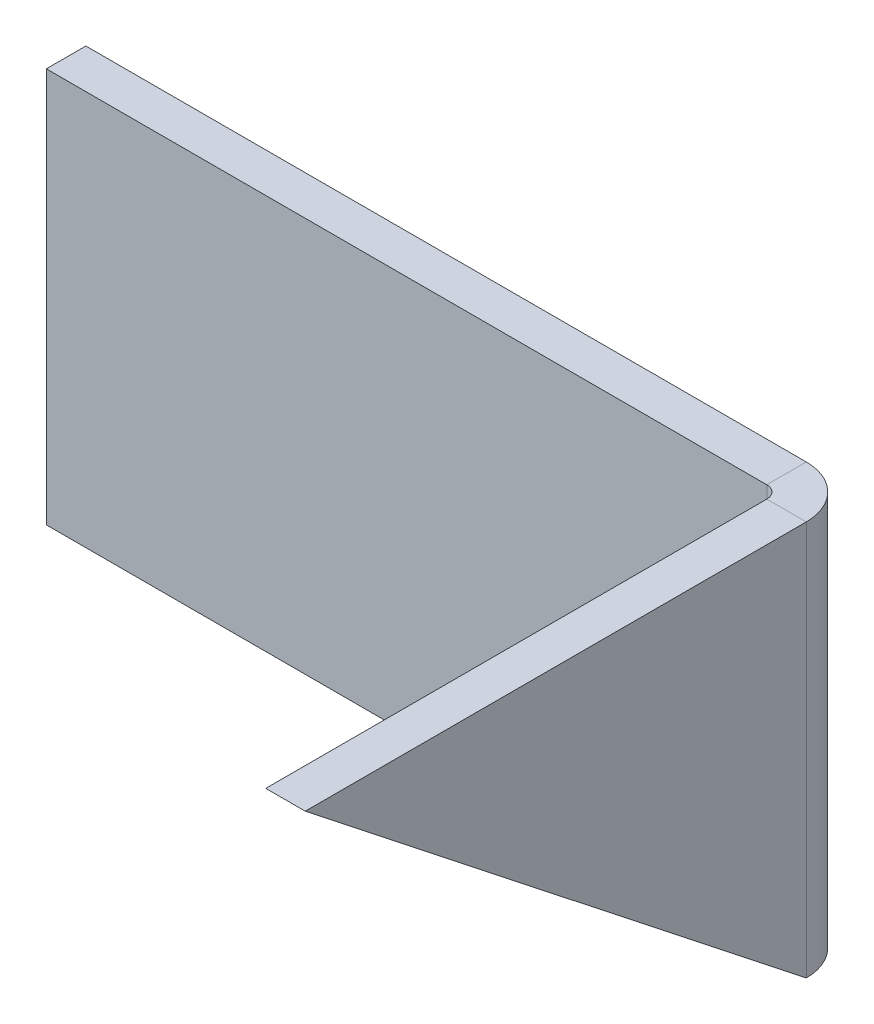
ISO-10303-21;
HEADER;
FILE_DESCRIPTION(('STEP AP214'),'2;1');
FILE_NAME('part.step','',(''),(''),'','','');
FILE_SCHEMA(('AUTOMOTIVE_DESIGN { 1 0 10303 214 1 1 1 1 }'));
ENDSEC;
DATA;
#1=APPLICATION_CONTEXT('core data for automotive mechanical design processes');
#2=APPLICATION_PROTOCOL_DEFINITION('international standard','automotive_design',2000,#1);
#3=PRODUCT_CONTEXT('',#1,'mechanical');
#4=PRODUCT('Part','Part','',(#3));
#5=PRODUCT_RELATED_PRODUCT_CATEGORY('part','',(#4));
#6=PRODUCT_DEFINITION_FORMATION('','',#4);
#7=PRODUCT_DEFINITION_CONTEXT('part definition',#1,'design');
#8=PRODUCT_DEFINITION('design','',#6,#7);
#9=PRODUCT_DEFINITION_SHAPE('','',#8);
#10=(LENGTH_UNIT() NAMED_UNIT(*) SI_UNIT(.MILLI.,.METRE.));
#11=(NAMED_UNIT(*) PLANE_ANGLE_UNIT() SI_UNIT($,.RADIAN.));
#12=(NAMED_UNIT(*) SI_UNIT($,.STERADIAN.) SOLID_ANGLE_UNIT());
#13=UNCERTAINTY_MEASURE_WITH_UNIT(LENGTH_MEASURE(1.E-05),#10,'distance_accuracy_value','');
#14=(GEOMETRIC_REPRESENTATION_CONTEXT(3) GLOBAL_UNCERTAINTY_ASSIGNED_CONTEXT((#13)) GLOBAL_UNIT_ASSIGNED_CONTEXT((#10,
#11,#12)) REPRESENTATION_CONTEXT('',''));
#15=CARTESIAN_POINT('',(0.,0.,0.));
#16=DIRECTION('',(0.,0.,1.));
#17=DIRECTION('',(1.,0.,0.));
#18=AXIS2_PLACEMENT_3D('',#15,#16,#17);
#19=CARTESIAN_POINT('',(33.131,0.,-1.13311373287466E-13));
#20=DIRECTION('',(-1.,0.,0.));
#21=DIRECTION('',(0.,0.,1.));
#22=AXIS2_PLACEMENT_3D('',#19,#20,#21);
#23=PLANE('',#22);
#24=DIRECTION('',(0.,-0.619090944115098,-0.785319299975924));
#25=VECTOR('',#24,1.);
#26=CARTESIAN_POINT('',(33.131,-15.875,4.17499999999999));
#27=LINE('',#26,#25);
#28=CARTESIAN_POINT('',(33.1310000000001,15.875,44.45));
#29=VERTEX_POINT('',#28);
#30=CARTESIAN_POINT('',(33.131,-15.875,4.17499999999999));
#31=VERTEX_POINT('',#30);
#32=EDGE_CURVE('E131',#29,#31,#27,.T.);
#33=ORIENTED_EDGE('',*,*,#32,.T.);
#34=DIRECTION('',(0.,1.,0.));
#35=VECTOR('',#34,1.);
#36=CARTESIAN_POINT('',(33.131,-15.875,4.17499999999999));
#37=LINE('',#36,#35);
#38=CARTESIAN_POINT('',(33.131,15.875,4.17499999999999));
#39=VERTEX_POINT('',#38);
#40=EDGE_CURVE('E151',#39,#31,#37,.F.);
#41=ORIENTED_EDGE('',*,*,#40,.F.);
#42=DIRECTION('',(0.,0.,1.));
#43=VECTOR('',#42,1.);
#44=CARTESIAN_POINT('',(33.131,15.875,-1.09308165265981E-13));
#45=LINE('',#44,#43);
#46=EDGE_CURVE('E137',#39,#29,#45,.T.);
#47=ORIENTED_EDGE('',*,*,#46,.T.);
#48=EDGE_LOOP('',(#33,#41,#47));
#49=FACE_BOUND('',#48,.T.);
#50=ADVANCED_FACE('F58',(#49),#23,.F.);
#51=CARTESIAN_POINT('',(29.956,0.,-1.02225920036639E-13));
#52=DIRECTION('',(-1.,0.,0.));
#53=DIRECTION('',(0.,0.,1.));
#54=AXIS2_PLACEMENT_3D('',#51,#52,#53);
#55=PLANE('',#54);
#56=DIRECTION('',(0.,1.,0.));
#57=VECTOR('',#56,1.);
#58=CARTESIAN_POINT('',(29.956,-15.875,4.175));
#59=LINE('',#58,#57);
#60=CARTESIAN_POINT('',(29.956,-15.875,4.175));
#61=VERTEX_POINT('',#60);
#62=CARTESIAN_POINT('',(29.956,15.875,4.175));
#63=VERTEX_POINT('',#62);
#64=EDGE_CURVE('E144',#61,#63,#59,.T.);
#65=ORIENTED_EDGE('',*,*,#64,.F.);
#66=DIRECTION('',(0.,-0.619090944115098,-0.785319299975924));
#67=VECTOR('',#66,1.);
#68=CARTESIAN_POINT('',(29.956,-15.875,4.175));
#69=LINE('',#68,#67);
#70=CARTESIAN_POINT('',(29.9560000000001,15.875,44.45));
#71=VERTEX_POINT('',#70);
#72=EDGE_CURVE('E128',#71,#61,#69,.T.);
#73=ORIENTED_EDGE('',*,*,#72,.F.);
#74=DIRECTION('',(0.,0.,-1.));
#75=VECTOR('',#74,1.);
#76=CARTESIAN_POINT('',(29.9560000000001,15.875,44.45));
#77=LINE('',#76,#75);
#78=EDGE_CURVE('E143',#63,#71,#77,.F.);
#79=ORIENTED_EDGE('',*,*,#78,.F.);
#80=EDGE_LOOP('',(#65,#73,#79));
#81=FACE_BOUND('',#80,.T.);
#82=ADVANCED_FACE('F142',(#81),#55,.T.);
#83=CARTESIAN_POINT('',(-28.956,15.875,3.175));
#84=DIRECTION('',(0.,-1.,0.));
#85=DIRECTION('',(0.,0.,-1.));
#86=AXIS2_PLACEMENT_3D('',#83,#84,#85);
#87=PLANE('',#86);
#88=DIRECTION('',(-1.,0.,0.));
#89=VECTOR('',#88,1.);
#90=CARTESIAN_POINT('',(-28.956,15.875,0.));
#91=LINE('',#90,#89);
#92=CARTESIAN_POINT('',(28.956,15.875,0.));
#93=VERTEX_POINT('',#92);
#94=CARTESIAN_POINT('',(-28.956,15.875,0.));
#95=VERTEX_POINT('',#94);
#96=EDGE_CURVE('E181',#93,#95,#91,.T.);
#97=ORIENTED_EDGE('',*,*,#96,.T.);
#98=DIRECTION('',(0.,0.,-1.));
#99=VECTOR('',#98,1.);
#100=CARTESIAN_POINT('',(-28.956,15.875,3.175));
#101=LINE('',#100,#99);
#102=CARTESIAN_POINT('',(-28.956,15.875,3.175));
#103=VERTEX_POINT('',#102);
#104=EDGE_CURVE('E67',#103,#95,#101,.T.);
#105=ORIENTED_EDGE('',*,*,#104,.F.);
#106=DIRECTION('',(-1.,0.,0.));
#107=VECTOR('',#106,1.);
#108=CARTESIAN_POINT('',(-28.956,15.875,3.175));
#109=LINE('',#108,#107);
#110=CARTESIAN_POINT('',(28.956,15.875,3.175));
#111=VERTEX_POINT('',#110);
#112=EDGE_CURVE('E103',#111,#103,#109,.T.);
#113=ORIENTED_EDGE('',*,*,#112,.F.);
#114=DIRECTION('',(0.,0.,-1.));
#115=VECTOR('',#114,1.);
#116=CARTESIAN_POINT('',(28.956,15.875,3.175));
#117=LINE('',#116,#115);
#118=EDGE_CURVE('E13',#111,#93,#117,.T.);
#119=ORIENTED_EDGE('',*,*,#118,.T.);
#120=EDGE_LOOP('',(#97,#105,#113,#119));
#121=FACE_BOUND('',#120,.T.);
#122=ADVANCED_FACE('F60',(#121),#87,.F.);
#123=CARTESIAN_POINT('',(-28.956,15.875,3.175));
#124=DIRECTION('',(1.,0.,0.));
#125=DIRECTION('',(0.,1.,0.));
#126=AXIS2_PLACEMENT_3D('',#123,#124,#125);
#127=PLANE('',#126);
#128=DIRECTION('',(0.,-1.,0.));
#129=VECTOR('',#128,1.);
#130=CARTESIAN_POINT('',(-28.956,15.875,0.));
#131=LINE('',#130,#129);
#132=CARTESIAN_POINT('',(-28.956,-15.875,0.));
#133=VERTEX_POINT('',#132);
#134=EDGE_CURVE('E90',#95,#133,#131,.T.);
#135=ORIENTED_EDGE('',*,*,#134,.T.);
#136=DIRECTION('',(0.,0.,-1.));
#137=VECTOR('',#136,1.);
#138=CARTESIAN_POINT('',(-28.956,-15.875,3.175));
#139=LINE('',#138,#137);
#140=CARTESIAN_POINT('',(-28.956,-15.875,3.175));
#141=VERTEX_POINT('',#140);
#142=EDGE_CURVE('E187',#141,#133,#139,.T.);
#143=ORIENTED_EDGE('',*,*,#142,.F.);
#144=DIRECTION('',(0.,-1.,0.));
#145=VECTOR('',#144,1.);
#146=CARTESIAN_POINT('',(-28.956,15.875,3.175));
#147=LINE('',#146,#145);
#148=EDGE_CURVE('E175',#103,#141,#147,.T.);
#149=ORIENTED_EDGE('',*,*,#148,.F.);
#150=ORIENTED_EDGE('',*,*,#104,.T.);
#151=EDGE_LOOP('',(#135,#143,#149,#150));
#152=FACE_BOUND('',#151,.T.);
#153=ADVANCED_FACE('F189',(#152),#127,.F.);
#154=CARTESIAN_POINT('',(-28.956,-15.875,3.175));
#155=DIRECTION('',(0.,1.,0.));
#156=DIRECTION('',(0.,0.,1.));
#157=AXIS2_PLACEMENT_3D('',#154,#155,#156);
#158=PLANE('',#157);
#159=DIRECTION('',(1.,0.,0.));
#160=VECTOR('',#159,1.);
#161=CARTESIAN_POINT('',(-28.956,-15.875,0.));
#162=LINE('',#161,#160);
#163=CARTESIAN_POINT('',(28.956,-15.875,0.));
#164=VERTEX_POINT('',#163);
#165=EDGE_CURVE('E96',#133,#164,#162,.T.);
#166=ORIENTED_EDGE('',*,*,#165,.T.);
#167=DIRECTION('',(0.,0.,-1.));
#168=VECTOR('',#167,1.);
#169=CARTESIAN_POINT('',(28.956,-15.875,3.175));
#170=LINE('',#169,#168);
#171=CARTESIAN_POINT('',(28.956,-15.875,3.175));
#172=VERTEX_POINT('',#171);
#173=EDGE_CURVE('E178',#172,#164,#170,.T.);
#174=ORIENTED_EDGE('',*,*,#173,.F.);
#175=DIRECTION('',(1.,0.,0.));
#176=VECTOR('',#175,1.);
#177=CARTESIAN_POINT('',(-28.956,-15.875,3.175));
#178=LINE('',#177,#176);
#179=EDGE_CURVE('E75',#141,#172,#178,.T.);
#180=ORIENTED_EDGE('',*,*,#179,.F.);
#181=ORIENTED_EDGE('',*,*,#142,.T.);
#182=EDGE_LOOP('',(#166,#174,#180,#181));
#183=FACE_BOUND('',#182,.T.);
#184=ADVANCED_FACE('F228',(#183),#158,.F.);
#185=CARTESIAN_POINT('',(0.,0.,3.175));
#186=DIRECTION('',(0.,0.,1.));
#187=DIRECTION('',(1.,0.,0.));
#188=AXIS2_PLACEMENT_3D('',#185,#186,#187);
#189=PLANE('',#188);
#190=DIRECTION('',(0.,1.,0.));
#191=VECTOR('',#190,1.);
#192=CARTESIAN_POINT('',(28.956,15.875,3.175));
#193=LINE('',#192,#191);
#194=EDGE_CURVE('E172',#172,#111,#193,.T.);
#195=ORIENTED_EDGE('',*,*,#194,.T.);
#196=ORIENTED_EDGE('',*,*,#112,.T.);
#197=ORIENTED_EDGE('',*,*,#148,.T.);
#198=ORIENTED_EDGE('',*,*,#179,.T.);
#199=EDGE_LOOP('',(#195,#196,#197,#198));
#200=FACE_BOUND('',#199,.T.);
#201=ADVANCED_FACE('F225',(#200),#189,.T.);
#202=CARTESIAN_POINT('',(0.,0.,0.));
#203=DIRECTION('',(0.,0.,1.));
#204=DIRECTION('',(1.,0.,0.));
#205=AXIS2_PLACEMENT_3D('',#202,#203,#204);
#206=PLANE('',#205);
#207=DIRECTION('',(0.,1.,0.));
#208=VECTOR('',#207,1.);
#209=CARTESIAN_POINT('',(28.956,15.875,0.));
#210=LINE('',#209,#208);
#211=EDGE_CURVE('E163',#164,#93,#210,.T.);
#212=ORIENTED_EDGE('',*,*,#211,.F.);
#213=ORIENTED_EDGE('',*,*,#165,.F.);
#214=ORIENTED_EDGE('',*,*,#134,.F.);
#215=ORIENTED_EDGE('',*,*,#96,.F.);
#216=EDGE_LOOP('',(#212,#213,#214,#215));
#217=FACE_BOUND('',#216,.T.);
#218=ADVANCED_FACE('F192',(#217),#206,.F.);
#219=CARTESIAN_POINT('',(28.956,-15.875,4.175));
#220=DIRECTION('',(0.,-1.,0.));
#221=DIRECTION('',(0.,0.,-1.));
#222=AXIS2_PLACEMENT_3D('',#219,#220,#221);
#223=PLANE('',#222);
#224=DIRECTION('',(-1.,0.,0.));
#225=VECTOR('',#224,1.);
#226=CARTESIAN_POINT('',(33.131,-15.875,4.17499999999999));
#227=LINE('',#226,#225);
#228=EDGE_CURVE('E145',#61,#31,#227,.F.);
#229=ORIENTED_EDGE('',*,*,#228,.F.);
#230=CARTESIAN_POINT('',(28.956,-15.875,4.175));
#231=DIRECTION('',(0.,1.,0.));
#232=DIRECTION('',(0.,0.,1.));
#233=AXIS2_PLACEMENT_3D('',#230,#231,#232);
#234=CIRCLE('',#233,1.);
#235=EDGE_CURVE('E167',#172,#61,#234,.F.);
#236=ORIENTED_EDGE('',*,*,#235,.F.);
#237=ORIENTED_EDGE('',*,*,#173,.T.);
#238=CARTESIAN_POINT('',(28.956,-15.875,4.175));
#239=DIRECTION('',(0.,1.,0.));
#240=DIRECTION('',(0.,0.,1.));
#241=AXIS2_PLACEMENT_3D('',#238,#239,#240);
#242=CIRCLE('',#241,4.175);
#243=EDGE_CURVE('E160',#164,#31,#242,.F.);
#244=ORIENTED_EDGE('',*,*,#243,.T.);
#245=EDGE_LOOP('',(#229,#236,#237,#244));
#246=FACE_BOUND('',#245,.T.);
#247=ADVANCED_FACE('F197',(#246),#223,.T.);
#248=CARTESIAN_POINT('',(28.956,15.875,4.175));
#249=DIRECTION('',(0.,-1.,0.));
#250=DIRECTION('',(0.,0.,-1.));
#251=AXIS2_PLACEMENT_3D('',#248,#249,#250);
#252=PLANE('',#251);
#253=CARTESIAN_POINT('',(28.956,15.875,4.175));
#254=DIRECTION('',(0.,1.,0.));
#255=DIRECTION('',(0.,0.,1.));
#256=AXIS2_PLACEMENT_3D('',#253,#254,#255);
#257=CIRCLE('',#256,1.);
#258=EDGE_CURVE('E136',#63,#111,#257,.T.);
#259=ORIENTED_EDGE('',*,*,#258,.F.);
#260=DIRECTION('',(-1.,0.,0.));
#261=VECTOR('',#260,1.);
#262=CARTESIAN_POINT('',(29.956,15.875,4.175));
#263=LINE('',#262,#261);
#264=EDGE_CURVE('E150',#63,#39,#263,.F.);
#265=ORIENTED_EDGE('',*,*,#264,.T.);
#266=CARTESIAN_POINT('',(28.956,15.875,4.175));
#267=DIRECTION('',(0.,1.,0.));
#268=DIRECTION('',(0.,0.,1.));
#269=AXIS2_PLACEMENT_3D('',#266,#267,#268);
#270=CIRCLE('',#269,4.175);
#271=EDGE_CURVE('E164',#39,#93,#270,.T.);
#272=ORIENTED_EDGE('',*,*,#271,.T.);
#273=ORIENTED_EDGE('',*,*,#118,.F.);
#274=EDGE_LOOP('',(#259,#265,#272,#273));
#275=FACE_BOUND('',#274,.T.);
#276=ADVANCED_FACE('F216',(#275),#252,.F.);
#277=CARTESIAN_POINT('',(28.956,15.875,4.175));
#278=DIRECTION('',(0.,1.,0.));
#279=DIRECTION('',(1.,0.,0.));
#280=AXIS2_PLACEMENT_3D('',#277,#278,#279);
#281=CYLINDRICAL_SURFACE('',#280,4.175);
#282=ORIENTED_EDGE('',*,*,#211,.T.);
#283=ORIENTED_EDGE('',*,*,#271,.F.);
#284=ORIENTED_EDGE('',*,*,#40,.T.);
#285=ORIENTED_EDGE('',*,*,#243,.F.);
#286=EDGE_LOOP('',(#282,#283,#284,#285));
#287=FACE_BOUND('',#286,.T.);
#288=ADVANCED_FACE('F199',(#287),#281,.T.);
#289=CARTESIAN_POINT('',(28.956,15.875,4.175));
#290=DIRECTION('',(0.,1.,0.));
#291=DIRECTION('',(1.,0.,0.));
#292=AXIS2_PLACEMENT_3D('',#289,#290,#291);
#293=CYLINDRICAL_SURFACE('',#292,1.);
#294=ORIENTED_EDGE('',*,*,#194,.F.);
#295=ORIENTED_EDGE('',*,*,#235,.T.);
#296=ORIENTED_EDGE('',*,*,#64,.T.);
#297=ORIENTED_EDGE('',*,*,#258,.T.);
#298=EDGE_LOOP('',(#294,#295,#296,#297));
#299=FACE_BOUND('',#298,.T.);
#300=ADVANCED_FACE('F213',(#299),#293,.F.);
#301=CARTESIAN_POINT('',(33.1310000000001,15.875,44.45));
#302=DIRECTION('',(0.,-1.,0.));
#303=DIRECTION('',(0.,0.,-1.));
#304=AXIS2_PLACEMENT_3D('',#301,#302,#303);
#305=PLANE('',#304);
#306=ORIENTED_EDGE('',*,*,#264,.F.);
#307=ORIENTED_EDGE('',*,*,#78,.T.);
#308=DIRECTION('',(-1.,0.,0.));
#309=VECTOR('',#308,1.);
#310=CARTESIAN_POINT('',(33.1310000000001,15.875,44.45));
#311=LINE('',#310,#309);
#312=EDGE_CURVE('E125',#29,#71,#311,.T.);
#313=ORIENTED_EDGE('',*,*,#312,.F.);
#314=ORIENTED_EDGE('',*,*,#46,.F.);
#315=EDGE_LOOP('',(#306,#307,#313,#314));
#316=FACE_BOUND('',#315,.T.);
#317=ADVANCED_FACE('F148',(#316),#305,.F.);
#318=CARTESIAN_POINT('',(33.131,-15.875,4.17499999999999));
#319=DIRECTION('',(0.,0.785319299975924,-0.619090944115098));
#320=DIRECTION('',(0.,-0.619090944115098,-0.785319299975924));
#321=AXIS2_PLACEMENT_3D('',#318,#319,#320);
#322=PLANE('',#321);
#323=ORIENTED_EDGE('',*,*,#32,.F.);
#324=ORIENTED_EDGE('',*,*,#312,.T.);
#325=ORIENTED_EDGE('',*,*,#72,.T.);
#326=ORIENTED_EDGE('',*,*,#228,.T.);
#327=EDGE_LOOP('',(#323,#324,#325,#326));
#328=FACE_BOUND('',#327,.T.);
#329=ADVANCED_FACE('F127',(#328),#322,.F.);
#330=CLOSED_SHELL('',(#50,#82,#122,#153,#184,#201,#218,#247,#276,#288,#300,#317,#329));
#331=MANIFOLD_SOLID_BREP('B2',#330);
#332=ADVANCED_BREP_SHAPE_REPRESENTATION('',(#18,#331),#14);
#333=SHAPE_DEFINITION_REPRESENTATION(#9,#332);
ENDSEC;
END-ISO-10303-21;
